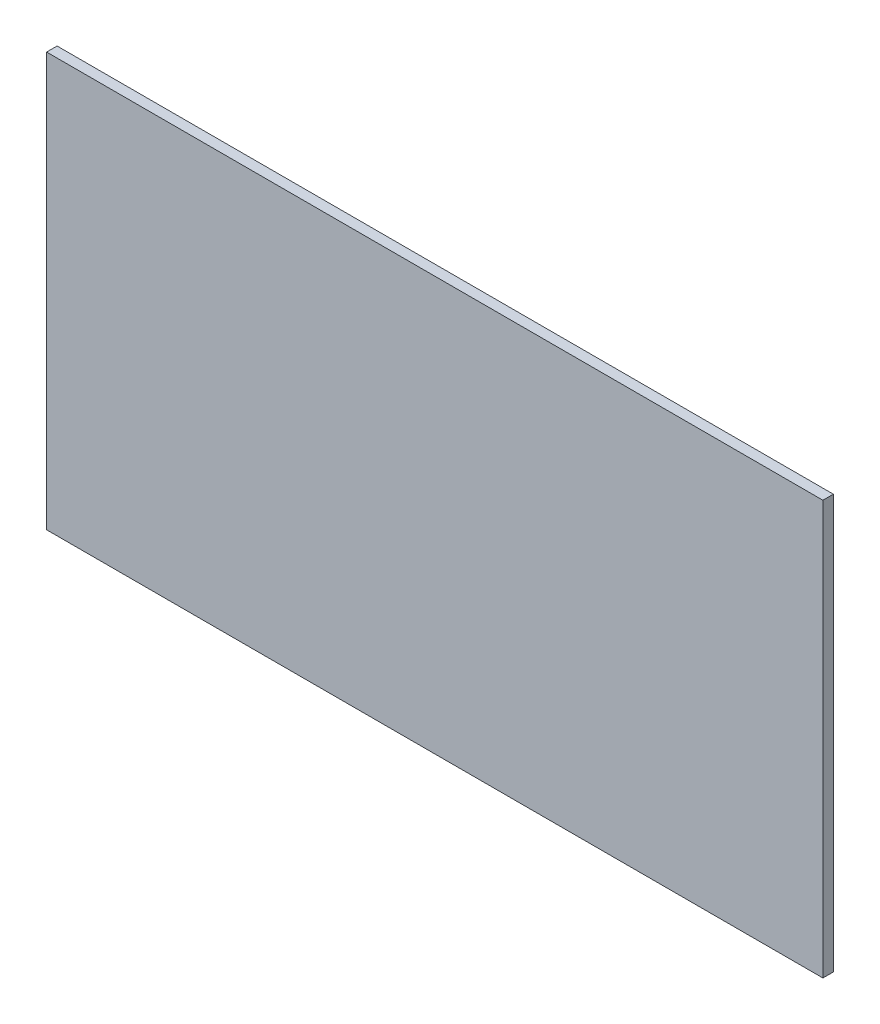
ISO-10303-21;
HEADER;
FILE_DESCRIPTION(('STEP AP214'),'2;1');
FILE_NAME('part.step','',(''),(''),'','','');
FILE_SCHEMA(('AUTOMOTIVE_DESIGN { 1 0 10303 214 1 1 1 1 }'));
ENDSEC;
DATA;
#1=APPLICATION_CONTEXT('core data for automotive mechanical design processes');
#2=APPLICATION_PROTOCOL_DEFINITION('international standard','automotive_design',2000,#1);
#3=PRODUCT_CONTEXT('',#1,'mechanical');
#4=PRODUCT('Part','Part','',(#3));
#5=PRODUCT_RELATED_PRODUCT_CATEGORY('part','',(#4));
#6=PRODUCT_DEFINITION_FORMATION('','',#4);
#7=PRODUCT_DEFINITION_CONTEXT('part definition',#1,'design');
#8=PRODUCT_DEFINITION('design','',#6,#7);
#9=PRODUCT_DEFINITION_SHAPE('','',#8);
#10=(LENGTH_UNIT() NAMED_UNIT(*) SI_UNIT(.MILLI.,.METRE.));
#11=(NAMED_UNIT(*) PLANE_ANGLE_UNIT() SI_UNIT($,.RADIAN.));
#12=(NAMED_UNIT(*) SI_UNIT($,.STERADIAN.) SOLID_ANGLE_UNIT());
#13=UNCERTAINTY_MEASURE_WITH_UNIT(LENGTH_MEASURE(1.E-05),#10,'distance_accuracy_value','');
#14=(GEOMETRIC_REPRESENTATION_CONTEXT(3) GLOBAL_UNCERTAINTY_ASSIGNED_CONTEXT((#13)) GLOBAL_UNIT_ASSIGNED_CONTEXT((#10,
#11,#12)) REPRESENTATION_CONTEXT('',''));
#15=CARTESIAN_POINT('',(0.,0.,0.));
#16=DIRECTION('',(0.,0.,1.));
#17=DIRECTION('',(1.,0.,0.));
#18=AXIS2_PLACEMENT_3D('',#15,#16,#17);
#19=CARTESIAN_POINT('',(74.104,0.,1.));
#20=DIRECTION('',(0.,1.,0.));
#21=DIRECTION('',(-1.,0.,0.));
#22=AXIS2_PLACEMENT_3D('',#19,#20,#21);
#23=PLANE('',#22);
#24=DIRECTION('',(1.,0.,0.));
#25=VECTOR('',#24,1.);
#26=CARTESIAN_POINT('',(74.104,0.,0.));
#27=LINE('',#26,#25);
#28=CARTESIAN_POINT('',(0.,0.,0.));
#29=VERTEX_POINT('',#28);
#30=CARTESIAN_POINT('',(74.104,0.,0.));
#31=VERTEX_POINT('',#30);
#32=EDGE_CURVE('E96',#29,#31,#27,.T.);
#33=ORIENTED_EDGE('',*,*,#32,.T.);
#34=DIRECTION('',(0.,0.,-1.));
#35=VECTOR('',#34,1.);
#36=CARTESIAN_POINT('',(74.104,0.,1.));
#37=LINE('',#36,#35);
#38=CARTESIAN_POINT('',(74.104,0.,1.));
#39=VERTEX_POINT('',#38);
#40=EDGE_CURVE('E11',#39,#31,#37,.T.);
#41=ORIENTED_EDGE('',*,*,#40,.F.);
#42=DIRECTION('',(1.,0.,0.));
#43=VECTOR('',#42,1.);
#44=CARTESIAN_POINT('',(74.104,0.,1.));
#45=LINE('',#44,#43);
#46=CARTESIAN_POINT('',(0.,0.,1.));
#47=VERTEX_POINT('',#46);
#48=EDGE_CURVE('E84',#47,#39,#45,.T.);
#49=ORIENTED_EDGE('',*,*,#48,.F.);
#50=DIRECTION('',(0.,0.,-1.));
#51=VECTOR('',#50,1.);
#52=CARTESIAN_POINT('',(0.,0.,1.));
#53=LINE('',#52,#51);
#54=EDGE_CURVE('E92',#47,#29,#53,.T.);
#55=ORIENTED_EDGE('',*,*,#54,.T.);
#56=EDGE_LOOP('',(#33,#41,#49,#55));
#57=FACE_BOUND('',#56,.T.);
#58=ADVANCED_FACE('F33',(#57),#23,.F.);
#59=CARTESIAN_POINT('',(74.104,39.5,1.));
#60=DIRECTION('',(-1.,0.,0.));
#61=DIRECTION('',(0.,0.,1.));
#62=AXIS2_PLACEMENT_3D('',#59,#60,#61);
#63=PLANE('',#62);
#64=DIRECTION('',(0.,1.,0.));
#65=VECTOR('',#64,1.);
#66=CARTESIAN_POINT('',(74.104,39.5,0.));
#67=LINE('',#66,#65);
#68=CARTESIAN_POINT('',(74.104,39.5,0.));
#69=VERTEX_POINT('',#68);
#70=EDGE_CURVE('E88',#31,#69,#67,.T.);
#71=ORIENTED_EDGE('',*,*,#70,.T.);
#72=DIRECTION('',(0.,0.,-1.));
#73=VECTOR('',#72,1.);
#74=CARTESIAN_POINT('',(74.104,39.5,1.));
#75=LINE('',#74,#73);
#76=CARTESIAN_POINT('',(74.104,39.5,1.));
#77=VERTEX_POINT('',#76);
#78=EDGE_CURVE('E41',#77,#69,#75,.T.);
#79=ORIENTED_EDGE('',*,*,#78,.F.);
#80=DIRECTION('',(0.,1.,0.));
#81=VECTOR('',#80,1.);
#82=CARTESIAN_POINT('',(74.104,39.5,1.));
#83=LINE('',#82,#81);
#84=EDGE_CURVE('E79',#39,#77,#83,.T.);
#85=ORIENTED_EDGE('',*,*,#84,.F.);
#86=ORIENTED_EDGE('',*,*,#40,.T.);
#87=EDGE_LOOP('',(#71,#79,#85,#86));
#88=FACE_BOUND('',#87,.T.);
#89=ADVANCED_FACE('F87',(#88),#63,.F.);
#90=CARTESIAN_POINT('',(0.,39.5,1.));
#91=DIRECTION('',(0.,-1.,0.));
#92=DIRECTION('',(0.,0.,-1.));
#93=AXIS2_PLACEMENT_3D('',#90,#91,#92);
#94=PLANE('',#93);
#95=DIRECTION('',(-1.,0.,0.));
#96=VECTOR('',#95,1.);
#97=CARTESIAN_POINT('',(0.,39.5,0.));
#98=LINE('',#97,#96);
#99=CARTESIAN_POINT('',(0.,39.5,0.));
#100=VERTEX_POINT('',#99);
#101=EDGE_CURVE('E66',#69,#100,#98,.T.);
#102=ORIENTED_EDGE('',*,*,#101,.T.);
#103=DIRECTION('',(0.,0.,-1.));
#104=VECTOR('',#103,1.);
#105=CARTESIAN_POINT('',(0.,39.5,1.));
#106=LINE('',#105,#104);
#107=CARTESIAN_POINT('',(0.,39.5,1.));
#108=VERTEX_POINT('',#107);
#109=EDGE_CURVE('E89',#108,#100,#106,.T.);
#110=ORIENTED_EDGE('',*,*,#109,.F.);
#111=DIRECTION('',(-1.,0.,0.));
#112=VECTOR('',#111,1.);
#113=CARTESIAN_POINT('',(0.,39.5,1.));
#114=LINE('',#113,#112);
#115=EDGE_CURVE('E82',#77,#108,#114,.T.);
#116=ORIENTED_EDGE('',*,*,#115,.F.);
#117=ORIENTED_EDGE('',*,*,#78,.T.);
#118=EDGE_LOOP('',(#102,#110,#116,#117));
#119=FACE_BOUND('',#118,.T.);
#120=ADVANCED_FACE('F90',(#119),#94,.F.);
#121=CARTESIAN_POINT('',(0.,0.,1.));
#122=DIRECTION('',(1.,0.,0.));
#123=DIRECTION('',(0.,0.,-1.));
#124=AXIS2_PLACEMENT_3D('',#121,#122,#123);
#125=PLANE('',#124);
#126=DIRECTION('',(0.,-1.,0.));
#127=VECTOR('',#126,1.);
#128=CARTESIAN_POINT('',(0.,0.,0.));
#129=LINE('',#128,#127);
#130=EDGE_CURVE('E72',#100,#29,#129,.T.);
#131=ORIENTED_EDGE('',*,*,#130,.T.);
#132=ORIENTED_EDGE('',*,*,#54,.F.);
#133=DIRECTION('',(0.,-1.,0.));
#134=VECTOR('',#133,1.);
#135=CARTESIAN_POINT('',(0.,0.,1.));
#136=LINE('',#135,#134);
#137=EDGE_CURVE('E49',#108,#47,#136,.T.);
#138=ORIENTED_EDGE('',*,*,#137,.F.);
#139=ORIENTED_EDGE('',*,*,#109,.T.);
#140=EDGE_LOOP('',(#131,#132,#138,#139));
#141=FACE_BOUND('',#140,.T.);
#142=ADVANCED_FACE('F103',(#141),#125,.F.);
#143=CARTESIAN_POINT('',(0.,0.,1.));
#144=DIRECTION('',(0.,0.,-1.));
#145=DIRECTION('',(-1.,0.,0.));
#146=AXIS2_PLACEMENT_3D('',#143,#144,#145);
#147=PLANE('',#146);
#148=ORIENTED_EDGE('',*,*,#48,.T.);
#149=ORIENTED_EDGE('',*,*,#84,.T.);
#150=ORIENTED_EDGE('',*,*,#115,.T.);
#151=ORIENTED_EDGE('',*,*,#137,.T.);
#152=EDGE_LOOP('',(#148,#149,#150,#151));
#153=FACE_BOUND('',#152,.T.);
#154=ADVANCED_FACE('F80',(#153),#147,.F.);
#155=CARTESIAN_POINT('',(0.,0.,0.));
#156=DIRECTION('',(0.,0.,-1.));
#157=DIRECTION('',(-1.,0.,0.));
#158=AXIS2_PLACEMENT_3D('',#155,#156,#157);
#159=PLANE('',#158);
#160=ORIENTED_EDGE('',*,*,#32,.F.);
#161=ORIENTED_EDGE('',*,*,#130,.F.);
#162=ORIENTED_EDGE('',*,*,#101,.F.);
#163=ORIENTED_EDGE('',*,*,#70,.F.);
#164=EDGE_LOOP('',(#160,#161,#162,#163));
#165=FACE_BOUND('',#164,.T.);
#166=ADVANCED_FACE('F106',(#165),#159,.T.);
#167=CLOSED_SHELL('',(#58,#89,#120,#142,#154,#166));
#168=MANIFOLD_SOLID_BREP('B2',#167);
#169=ADVANCED_BREP_SHAPE_REPRESENTATION('',(#18,#168),#14);
#170=SHAPE_DEFINITION_REPRESENTATION(#9,#169);
ENDSEC;
END-ISO-10303-21;
